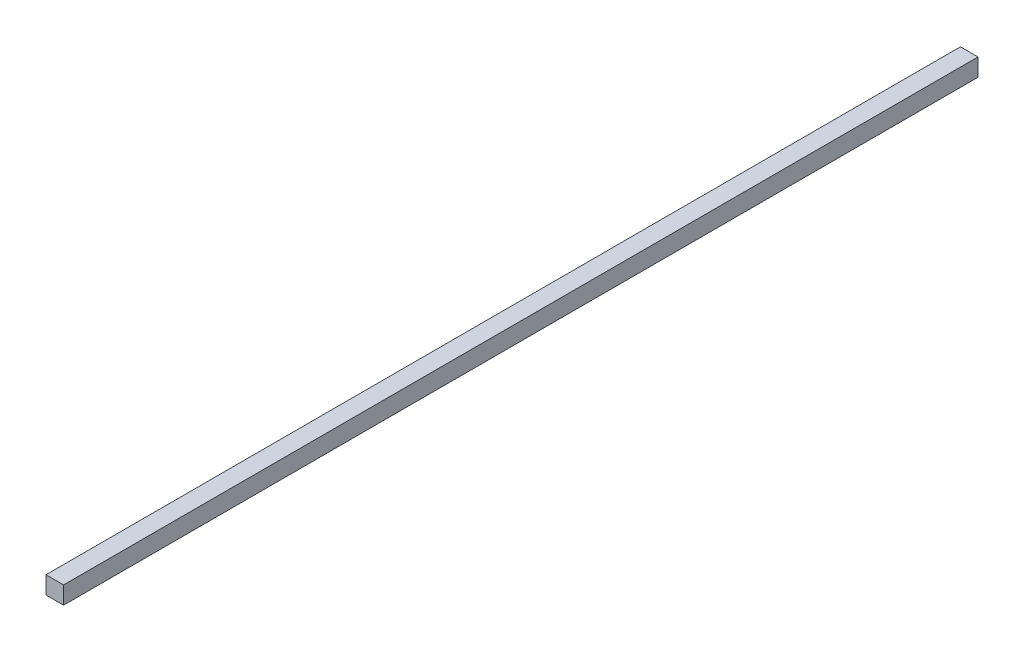
ISO-10303-21;
HEADER;
FILE_DESCRIPTION(('STEP AP214'),'2;1');
FILE_NAME('part.step','',(''),(''),'','','');
FILE_SCHEMA(('AUTOMOTIVE_DESIGN { 1 0 10303 214 1 1 1 1 }'));
ENDSEC;
DATA;
#1=APPLICATION_CONTEXT('core data for automotive mechanical design processes');
#2=APPLICATION_PROTOCOL_DEFINITION('international standard','automotive_design',2000,#1);
#3=PRODUCT_CONTEXT('',#1,'mechanical');
#4=PRODUCT('Part','Part','',(#3));
#5=PRODUCT_RELATED_PRODUCT_CATEGORY('part','',(#4));
#6=PRODUCT_DEFINITION_FORMATION('','',#4);
#7=PRODUCT_DEFINITION_CONTEXT('part definition',#1,'design');
#8=PRODUCT_DEFINITION('design','',#6,#7);
#9=PRODUCT_DEFINITION_SHAPE('','',#8);
#10=(LENGTH_UNIT() NAMED_UNIT(*) SI_UNIT(.MILLI.,.METRE.));
#11=(NAMED_UNIT(*) PLANE_ANGLE_UNIT() SI_UNIT($,.RADIAN.));
#12=(NAMED_UNIT(*) SI_UNIT($,.STERADIAN.) SOLID_ANGLE_UNIT());
#13=UNCERTAINTY_MEASURE_WITH_UNIT(LENGTH_MEASURE(1.E-05),#10,'distance_accuracy_value','');
#14=(GEOMETRIC_REPRESENTATION_CONTEXT(3) GLOBAL_UNCERTAINTY_ASSIGNED_CONTEXT((#13)) GLOBAL_UNIT_ASSIGNED_CONTEXT((#10,
#11,#12)) REPRESENTATION_CONTEXT('',''));
#15=CARTESIAN_POINT('',(0.,0.,0.));
#16=DIRECTION('',(0.,0.,1.));
#17=DIRECTION('',(1.,0.,0.));
#18=AXIS2_PLACEMENT_3D('',#15,#16,#17);
#19=CARTESIAN_POINT('',(2.5,-2.5,260.));
#20=DIRECTION('',(-1.,0.,0.));
#21=DIRECTION('',(0.,0.,1.));
#22=AXIS2_PLACEMENT_3D('',#19,#20,#21);
#23=PLANE('',#22);
#24=DIRECTION('',(0.,1.,0.));
#25=VECTOR('',#24,1.);
#26=CARTESIAN_POINT('',(2.5,-2.5,0.));
#27=LINE('',#26,#25);
#28=CARTESIAN_POINT('',(2.5,-2.5,0.));
#29=VERTEX_POINT('',#28);
#30=CARTESIAN_POINT('',(2.5,2.5,0.));
#31=VERTEX_POINT('',#30);
#32=EDGE_CURVE('E111',#29,#31,#27,.T.);
#33=ORIENTED_EDGE('',*,*,#32,.T.);
#34=DIRECTION('',(0.,0.,-1.));
#35=VECTOR('',#34,1.);
#36=CARTESIAN_POINT('',(2.5,2.5,260.));
#37=LINE('',#36,#35);
#38=CARTESIAN_POINT('',(2.5,2.5,260.));
#39=VERTEX_POINT('',#38);
#40=EDGE_CURVE('E11',#39,#31,#37,.T.);
#41=ORIENTED_EDGE('',*,*,#40,.F.);
#42=DIRECTION('',(0.,1.,0.));
#43=VECTOR('',#42,1.);
#44=CARTESIAN_POINT('',(2.5,-2.5,260.));
#45=LINE('',#44,#43);
#46=CARTESIAN_POINT('',(2.5,-2.5,260.));
#47=VERTEX_POINT('',#46);
#48=EDGE_CURVE('E95',#47,#39,#45,.T.);
#49=ORIENTED_EDGE('',*,*,#48,.F.);
#50=DIRECTION('',(0.,0.,-1.));
#51=VECTOR('',#50,1.);
#52=CARTESIAN_POINT('',(2.5,-2.5,260.));
#53=LINE('',#52,#51);
#54=EDGE_CURVE('E107',#47,#29,#53,.T.);
#55=ORIENTED_EDGE('',*,*,#54,.T.);
#56=EDGE_LOOP('',(#33,#41,#49,#55));
#57=FACE_BOUND('',#56,.T.);
#58=ADVANCED_FACE('F43',(#57),#23,.F.);
#59=CARTESIAN_POINT('',(-2.5,2.5,260.));
#60=DIRECTION('',(0.,-1.,0.));
#61=DIRECTION('',(0.,0.,-1.));
#62=AXIS2_PLACEMENT_3D('',#59,#60,#61);
#63=PLANE('',#62);
#64=DIRECTION('',(-1.,0.,0.));
#65=VECTOR('',#64,1.);
#66=CARTESIAN_POINT('',(-2.5,2.5,0.));
#67=LINE('',#66,#65);
#68=CARTESIAN_POINT('',(-2.5,2.5,0.));
#69=VERTEX_POINT('',#68);
#70=EDGE_CURVE('E100',#31,#69,#67,.T.);
#71=ORIENTED_EDGE('',*,*,#70,.T.);
#72=DIRECTION('',(0.,0.,-1.));
#73=VECTOR('',#72,1.);
#74=CARTESIAN_POINT('',(-2.5,2.5,260.));
#75=LINE('',#74,#73);
#76=CARTESIAN_POINT('',(-2.5,2.5,260.));
#77=VERTEX_POINT('',#76);
#78=EDGE_CURVE('E52',#77,#69,#75,.T.);
#79=ORIENTED_EDGE('',*,*,#78,.F.);
#80=DIRECTION('',(-1.,0.,0.));
#81=VECTOR('',#80,1.);
#82=CARTESIAN_POINT('',(-2.5,2.5,260.));
#83=LINE('',#82,#81);
#84=EDGE_CURVE('E90',#39,#77,#83,.T.);
#85=ORIENTED_EDGE('',*,*,#84,.F.);
#86=ORIENTED_EDGE('',*,*,#40,.T.);
#87=EDGE_LOOP('',(#71,#79,#85,#86));
#88=FACE_BOUND('',#87,.T.);
#89=ADVANCED_FACE('F99',(#88),#63,.F.);
#90=CARTESIAN_POINT('',(-2.5,-2.5,260.));
#91=DIRECTION('',(1.,0.,0.));
#92=DIRECTION('',(0.,0.,-1.));
#93=AXIS2_PLACEMENT_3D('',#90,#91,#92);
#94=PLANE('',#93);
#95=DIRECTION('',(0.,-1.,0.));
#96=VECTOR('',#95,1.);
#97=CARTESIAN_POINT('',(-2.5,-2.5,0.));
#98=LINE('',#97,#96);
#99=CARTESIAN_POINT('',(-2.5,-2.5,0.));
#100=VERTEX_POINT('',#99);
#101=EDGE_CURVE('E77',#69,#100,#98,.T.);
#102=ORIENTED_EDGE('',*,*,#101,.T.);
#103=DIRECTION('',(0.,0.,-1.));
#104=VECTOR('',#103,1.);
#105=CARTESIAN_POINT('',(-2.5,-2.5,260.));
#106=LINE('',#105,#104);
#107=CARTESIAN_POINT('',(-2.5,-2.5,260.));
#108=VERTEX_POINT('',#107);
#109=EDGE_CURVE('E102',#108,#100,#106,.T.);
#110=ORIENTED_EDGE('',*,*,#109,.F.);
#111=DIRECTION('',(0.,-1.,0.));
#112=VECTOR('',#111,1.);
#113=CARTESIAN_POINT('',(-2.5,-2.5,260.));
#114=LINE('',#113,#112);
#115=EDGE_CURVE('E93',#77,#108,#114,.T.);
#116=ORIENTED_EDGE('',*,*,#115,.F.);
#117=ORIENTED_EDGE('',*,*,#78,.T.);
#118=EDGE_LOOP('',(#102,#110,#116,#117));
#119=FACE_BOUND('',#118,.T.);
#120=ADVANCED_FACE('F103',(#119),#94,.F.);
#121=CARTESIAN_POINT('',(-2.5,-2.5,260.));
#122=DIRECTION('',(0.,1.,0.));
#123=DIRECTION('',(0.,0.,1.));
#124=AXIS2_PLACEMENT_3D('',#121,#122,#123);
#125=PLANE('',#124);
#126=DIRECTION('',(1.,0.,0.));
#127=VECTOR('',#126,1.);
#128=CARTESIAN_POINT('',(-2.5,-2.5,0.));
#129=LINE('',#128,#127);
#130=EDGE_CURVE('E83',#100,#29,#129,.T.);
#131=ORIENTED_EDGE('',*,*,#130,.T.);
#132=ORIENTED_EDGE('',*,*,#54,.F.);
#133=DIRECTION('',(1.,0.,0.));
#134=VECTOR('',#133,1.);
#135=CARTESIAN_POINT('',(-2.5,-2.5,260.));
#136=LINE('',#135,#134);
#137=EDGE_CURVE('E60',#108,#47,#136,.T.);
#138=ORIENTED_EDGE('',*,*,#137,.F.);
#139=ORIENTED_EDGE('',*,*,#109,.T.);
#140=EDGE_LOOP('',(#131,#132,#138,#139));
#141=FACE_BOUND('',#140,.T.);
#142=ADVANCED_FACE('F124',(#141),#125,.F.);
#143=CARTESIAN_POINT('',(0.,0.,260.));
#144=DIRECTION('',(0.,0.,-1.));
#145=DIRECTION('',(-1.,0.,0.));
#146=AXIS2_PLACEMENT_3D('',#143,#144,#145);
#147=PLANE('',#146);
#148=ORIENTED_EDGE('',*,*,#48,.T.);
#149=ORIENTED_EDGE('',*,*,#84,.T.);
#150=ORIENTED_EDGE('',*,*,#115,.T.);
#151=ORIENTED_EDGE('',*,*,#137,.T.);
#152=EDGE_LOOP('',(#148,#149,#150,#151));
#153=FACE_BOUND('',#152,.T.);
#154=ADVANCED_FACE('F91',(#153),#147,.F.);
#155=CARTESIAN_POINT('',(0.,0.,0.));
#156=DIRECTION('',(0.,0.,-1.));
#157=DIRECTION('',(-1.,0.,0.));
#158=AXIS2_PLACEMENT_3D('',#155,#156,#157);
#159=PLANE('',#158);
#160=ORIENTED_EDGE('',*,*,#32,.F.);
#161=ORIENTED_EDGE('',*,*,#130,.F.);
#162=ORIENTED_EDGE('',*,*,#101,.F.);
#163=ORIENTED_EDGE('',*,*,#70,.F.);
#164=EDGE_LOOP('',(#160,#161,#162,#163));
#165=FACE_BOUND('',#164,.T.);
#166=ADVANCED_FACE('F127',(#165),#159,.T.);
#167=CLOSED_SHELL('',(#58,#89,#120,#142,#154,#166));
#168=MANIFOLD_SOLID_BREP('B2',#167);
#169=ADVANCED_BREP_SHAPE_REPRESENTATION('',(#18,#168),#14);
#170=SHAPE_DEFINITION_REPRESENTATION(#9,#169);
ENDSEC;
END-ISO-10303-21;
